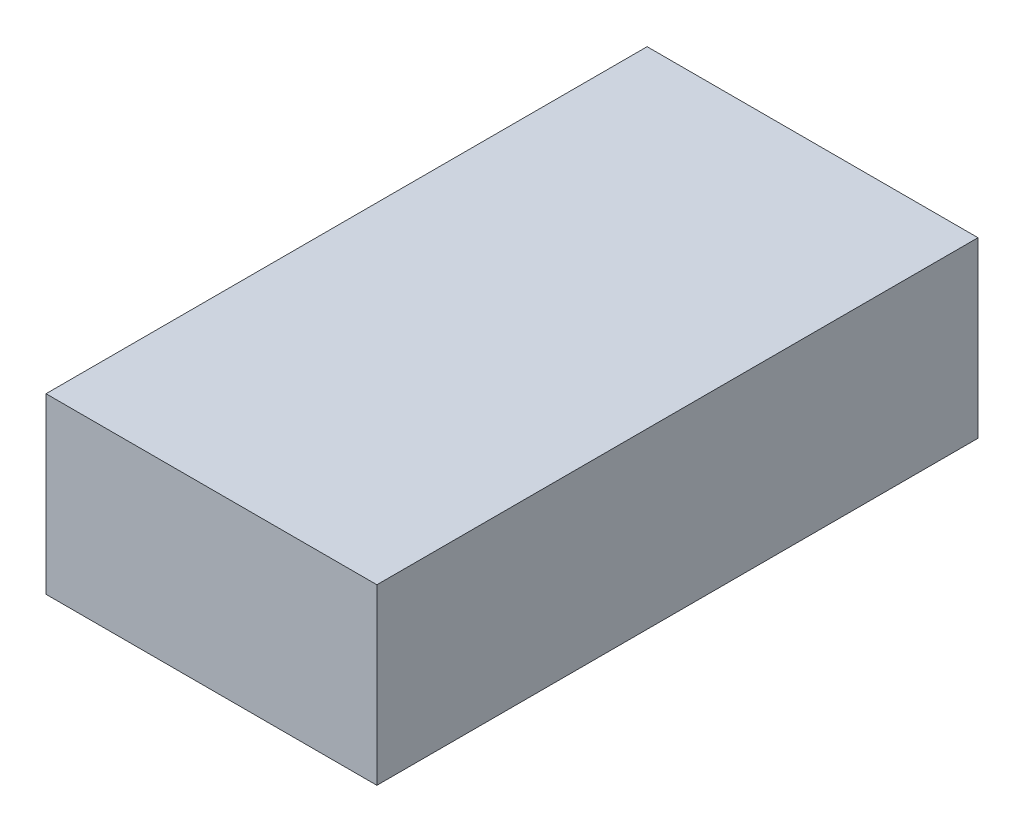
ISO-10303-21;
HEADER;
FILE_DESCRIPTION(('STEP AP214'),'2;1');
FILE_NAME('part.step','',(''),(''),'','','');
FILE_SCHEMA(('AUTOMOTIVE_DESIGN { 1 0 10303 214 1 1 1 1 }'));
ENDSEC;
DATA;
#1=APPLICATION_CONTEXT('core data for automotive mechanical design processes');
#2=APPLICATION_PROTOCOL_DEFINITION('international standard','automotive_design',2000,#1);
#3=PRODUCT_CONTEXT('',#1,'mechanical');
#4=PRODUCT('Part','Part','',(#3));
#5=PRODUCT_RELATED_PRODUCT_CATEGORY('part','',(#4));
#6=PRODUCT_DEFINITION_FORMATION('','',#4);
#7=PRODUCT_DEFINITION_CONTEXT('part definition',#1,'design');
#8=PRODUCT_DEFINITION('design','',#6,#7);
#9=PRODUCT_DEFINITION_SHAPE('','',#8);
#10=(LENGTH_UNIT() NAMED_UNIT(*) SI_UNIT(.MILLI.,.METRE.));
#11=(NAMED_UNIT(*) PLANE_ANGLE_UNIT() SI_UNIT($,.RADIAN.));
#12=(NAMED_UNIT(*) SI_UNIT($,.STERADIAN.) SOLID_ANGLE_UNIT());
#13=UNCERTAINTY_MEASURE_WITH_UNIT(LENGTH_MEASURE(1.E-05),#10,'distance_accuracy_value','');
#14=(GEOMETRIC_REPRESENTATION_CONTEXT(3) GLOBAL_UNCERTAINTY_ASSIGNED_CONTEXT((#13)) GLOBAL_UNIT_ASSIGNED_CONTEXT((#10,
#11,#12)) REPRESENTATION_CONTEXT('',''));
#15=CARTESIAN_POINT('',(0.,0.,0.));
#16=DIRECTION('',(0.,0.,1.));
#17=DIRECTION('',(1.,0.,0.));
#18=AXIS2_PLACEMENT_3D('',#15,#16,#17);
#19=CARTESIAN_POINT('',(60.,63.,109.));
#20=DIRECTION('',(-1.,0.,0.));
#21=DIRECTION('',(0.,0.,1.));
#22=AXIS2_PLACEMENT_3D('',#19,#20,#21);
#23=PLANE('',#22);
#24=DIRECTION('',(0.,0.,-1.));
#25=VECTOR('',#24,1.);
#26=CARTESIAN_POINT('',(60.,0.,109.));
#27=LINE('',#26,#25);
#28=CARTESIAN_POINT('',(60.,0.,109.));
#29=VERTEX_POINT('',#28);
#30=CARTESIAN_POINT('',(60.,0.,-109.));
#31=VERTEX_POINT('',#30);
#32=EDGE_CURVE('E97',#29,#31,#27,.T.);
#33=ORIENTED_EDGE('',*,*,#32,.T.);
#34=DIRECTION('',(0.,-1.,0.));
#35=VECTOR('',#34,1.);
#36=CARTESIAN_POINT('',(60.,63.,-109.));
#37=LINE('',#36,#35);
#38=CARTESIAN_POINT('',(60.,63.,-109.));
#39=VERTEX_POINT('',#38);
#40=EDGE_CURVE('E11',#39,#31,#37,.T.);
#41=ORIENTED_EDGE('',*,*,#40,.F.);
#42=DIRECTION('',(0.,0.,-1.));
#43=VECTOR('',#42,1.);
#44=CARTESIAN_POINT('',(60.,63.,109.));
#45=LINE('',#44,#43);
#46=CARTESIAN_POINT('',(60.,63.,109.));
#47=VERTEX_POINT('',#46);
#48=EDGE_CURVE('E85',#47,#39,#45,.T.);
#49=ORIENTED_EDGE('',*,*,#48,.F.);
#50=DIRECTION('',(0.,-1.,0.));
#51=VECTOR('',#50,1.);
#52=CARTESIAN_POINT('',(60.,63.,109.));
#53=LINE('',#52,#51);
#54=EDGE_CURVE('E93',#47,#29,#53,.T.);
#55=ORIENTED_EDGE('',*,*,#54,.T.);
#56=EDGE_LOOP('',(#33,#41,#49,#55));
#57=FACE_BOUND('',#56,.T.);
#58=ADVANCED_FACE('F34',(#57),#23,.F.);
#59=CARTESIAN_POINT('',(-60.,63.,-109.));
#60=DIRECTION('',(0.,0.,1.));
#61=DIRECTION('',(1.,0.,0.));
#62=AXIS2_PLACEMENT_3D('',#59,#60,#61);
#63=PLANE('',#62);
#64=DIRECTION('',(-1.,0.,0.));
#65=VECTOR('',#64,1.);
#66=CARTESIAN_POINT('',(-60.,0.,-109.));
#67=LINE('',#66,#65);
#68=CARTESIAN_POINT('',(-60.,0.,-109.));
#69=VERTEX_POINT('',#68);
#70=EDGE_CURVE('E89',#31,#69,#67,.T.);
#71=ORIENTED_EDGE('',*,*,#70,.T.);
#72=DIRECTION('',(0.,-1.,0.));
#73=VECTOR('',#72,1.);
#74=CARTESIAN_POINT('',(-60.,63.,-109.));
#75=LINE('',#74,#73);
#76=CARTESIAN_POINT('',(-60.,63.,-109.));
#77=VERTEX_POINT('',#76);
#78=EDGE_CURVE('E42',#77,#69,#75,.T.);
#79=ORIENTED_EDGE('',*,*,#78,.F.);
#80=DIRECTION('',(-1.,0.,0.));
#81=VECTOR('',#80,1.);
#82=CARTESIAN_POINT('',(-60.,63.,-109.));
#83=LINE('',#82,#81);
#84=EDGE_CURVE('E80',#39,#77,#83,.T.);
#85=ORIENTED_EDGE('',*,*,#84,.F.);
#86=ORIENTED_EDGE('',*,*,#40,.T.);
#87=EDGE_LOOP('',(#71,#79,#85,#86));
#88=FACE_BOUND('',#87,.T.);
#89=ADVANCED_FACE('F88',(#88),#63,.F.);
#90=CARTESIAN_POINT('',(-60.,63.,109.));
#91=DIRECTION('',(1.,0.,0.));
#92=DIRECTION('',(0.,0.,-1.));
#93=AXIS2_PLACEMENT_3D('',#90,#91,#92);
#94=PLANE('',#93);
#95=DIRECTION('',(0.,0.,1.));
#96=VECTOR('',#95,1.);
#97=CARTESIAN_POINT('',(-60.,0.,109.));
#98=LINE('',#97,#96);
#99=CARTESIAN_POINT('',(-60.,0.,109.));
#100=VERTEX_POINT('',#99);
#101=EDGE_CURVE('E67',#69,#100,#98,.T.);
#102=ORIENTED_EDGE('',*,*,#101,.T.);
#103=DIRECTION('',(0.,-1.,0.));
#104=VECTOR('',#103,1.);
#105=CARTESIAN_POINT('',(-60.,63.,109.));
#106=LINE('',#105,#104);
#107=CARTESIAN_POINT('',(-60.,63.,109.));
#108=VERTEX_POINT('',#107);
#109=EDGE_CURVE('E90',#108,#100,#106,.T.);
#110=ORIENTED_EDGE('',*,*,#109,.F.);
#111=DIRECTION('',(0.,0.,1.));
#112=VECTOR('',#111,1.);
#113=CARTESIAN_POINT('',(-60.,63.,109.));
#114=LINE('',#113,#112);
#115=EDGE_CURVE('E83',#77,#108,#114,.T.);
#116=ORIENTED_EDGE('',*,*,#115,.F.);
#117=ORIENTED_EDGE('',*,*,#78,.T.);
#118=EDGE_LOOP('',(#102,#110,#116,#117));
#119=FACE_BOUND('',#118,.T.);
#120=ADVANCED_FACE('F91',(#119),#94,.F.);
#121=CARTESIAN_POINT('',(-60.,63.,109.));
#122=DIRECTION('',(0.,0.,-1.));
#123=DIRECTION('',(-1.,0.,0.));
#124=AXIS2_PLACEMENT_3D('',#121,#122,#123);
#125=PLANE('',#124);
#126=DIRECTION('',(1.,0.,0.));
#127=VECTOR('',#126,1.);
#128=CARTESIAN_POINT('',(-60.,0.,109.));
#129=LINE('',#128,#127);
#130=EDGE_CURVE('E73',#100,#29,#129,.T.);
#131=ORIENTED_EDGE('',*,*,#130,.T.);
#132=ORIENTED_EDGE('',*,*,#54,.F.);
#133=DIRECTION('',(1.,0.,0.));
#134=VECTOR('',#133,1.);
#135=CARTESIAN_POINT('',(-60.,63.,109.));
#136=LINE('',#135,#134);
#137=EDGE_CURVE('E50',#108,#47,#136,.T.);
#138=ORIENTED_EDGE('',*,*,#137,.F.);
#139=ORIENTED_EDGE('',*,*,#109,.T.);
#140=EDGE_LOOP('',(#131,#132,#138,#139));
#141=FACE_BOUND('',#140,.T.);
#142=ADVANCED_FACE('F104',(#141),#125,.F.);
#143=CARTESIAN_POINT('',(0.,63.,0.));
#144=DIRECTION('',(0.,-1.,0.));
#145=DIRECTION('',(0.,0.,-1.));
#146=AXIS2_PLACEMENT_3D('',#143,#144,#145);
#147=PLANE('',#146);
#148=ORIENTED_EDGE('',*,*,#48,.T.);
#149=ORIENTED_EDGE('',*,*,#84,.T.);
#150=ORIENTED_EDGE('',*,*,#115,.T.);
#151=ORIENTED_EDGE('',*,*,#137,.T.);
#152=EDGE_LOOP('',(#148,#149,#150,#151));
#153=FACE_BOUND('',#152,.T.);
#154=ADVANCED_FACE('F81',(#153),#147,.F.);
#155=CARTESIAN_POINT('',(0.,0.,0.));
#156=DIRECTION('',(0.,-1.,0.));
#157=DIRECTION('',(0.,0.,-1.));
#158=AXIS2_PLACEMENT_3D('',#155,#156,#157);
#159=PLANE('',#158);
#160=ORIENTED_EDGE('',*,*,#32,.F.);
#161=ORIENTED_EDGE('',*,*,#130,.F.);
#162=ORIENTED_EDGE('',*,*,#101,.F.);
#163=ORIENTED_EDGE('',*,*,#70,.F.);
#164=EDGE_LOOP('',(#160,#161,#162,#163));
#165=FACE_BOUND('',#164,.T.);
#166=ADVANCED_FACE('F107',(#165),#159,.T.);
#167=CLOSED_SHELL('',(#58,#89,#120,#142,#154,#166));
#168=MANIFOLD_SOLID_BREP('B2',#167);
#169=ADVANCED_BREP_SHAPE_REPRESENTATION('',(#18,#168),#14);
#170=SHAPE_DEFINITION_REPRESENTATION(#9,#169);
ENDSEC;
END-ISO-10303-21;
